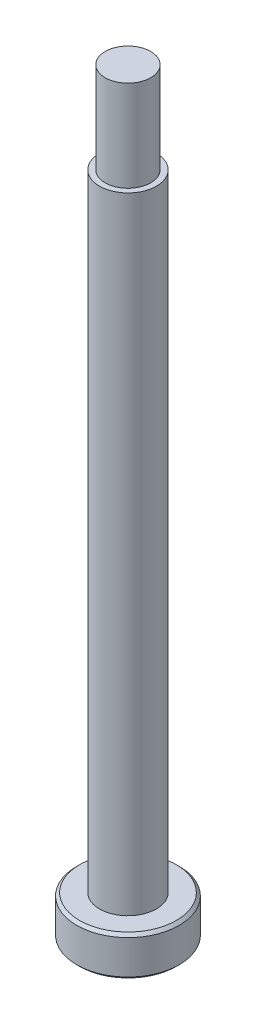
ISO-10303-21;
HEADER;
FILE_DESCRIPTION(('STEP AP214'),'2;1');
FILE_NAME('part.step','',(''),(''),'','','');
FILE_SCHEMA(('AUTOMOTIVE_DESIGN { 1 0 10303 214 1 1 1 1 }'));
ENDSEC;
DATA;
#1=APPLICATION_CONTEXT('core data for automotive mechanical design processes');
#2=APPLICATION_PROTOCOL_DEFINITION('international standard','automotive_design',2000,#1);
#3=PRODUCT_CONTEXT('',#1,'mechanical');
#4=PRODUCT('Part','Part','',(#3));
#5=PRODUCT_RELATED_PRODUCT_CATEGORY('part','',(#4));
#6=PRODUCT_DEFINITION_FORMATION('','',#4);
#7=PRODUCT_DEFINITION_CONTEXT('part definition',#1,'design');
#8=PRODUCT_DEFINITION('design','',#6,#7);
#9=PRODUCT_DEFINITION_SHAPE('','',#8);
#10=(LENGTH_UNIT() NAMED_UNIT(*) SI_UNIT(.MILLI.,.METRE.));
#11=(NAMED_UNIT(*) PLANE_ANGLE_UNIT() SI_UNIT($,.RADIAN.));
#12=(NAMED_UNIT(*) SI_UNIT($,.STERADIAN.) SOLID_ANGLE_UNIT());
#13=UNCERTAINTY_MEASURE_WITH_UNIT(LENGTH_MEASURE(1.E-05),#10,'distance_accuracy_value','');
#14=(GEOMETRIC_REPRESENTATION_CONTEXT(3) GLOBAL_UNCERTAINTY_ASSIGNED_CONTEXT((#13)) GLOBAL_UNIT_ASSIGNED_CONTEXT((#10,
#11,#12)) REPRESENTATION_CONTEXT('',''));
#15=CARTESIAN_POINT('',(0.,0.,0.));
#16=DIRECTION('',(0.,0.,1.));
#17=DIRECTION('',(1.,0.,0.));
#18=AXIS2_PLACEMENT_3D('',#15,#16,#17);
#19=CARTESIAN_POINT('',(0.,-3.5,0.));
#20=DIRECTION('',(0.,1.,0.));
#21=DIRECTION('',(0.,0.,1.));
#22=AXIS2_PLACEMENT_3D('',#19,#20,#21);
#23=CYLINDRICAL_SURFACE('',#22,4.5);
#24=CARTESIAN_POINT('',(0.,-0.250000000000005,0.));
#25=DIRECTION('',(0.,1.,0.));
#26=DIRECTION('',(0.,0.,1.));
#27=AXIS2_PLACEMENT_3D('',#24,#25,#26);
#28=CIRCLE('',#27,4.5);
#29=CARTESIAN_POINT('',(0.,-0.250000000000005,4.5));
#30=VERTEX_POINT('',#29);
#31=EDGE_CURVE('E57',#30,#30,#28,.F.);
#32=ORIENTED_EDGE('',*,*,#31,.T.);
#33=EDGE_LOOP('',(#32));
#34=FACE_BOUND('',#33,.T.);
#35=CARTESIAN_POINT('',(0.,-3.24999999999998,0.));
#36=DIRECTION('',(0.,1.,0.));
#37=DIRECTION('',(0.,0.,1.));
#38=AXIS2_PLACEMENT_3D('',#35,#36,#37);
#39=CIRCLE('',#38,4.5);
#40=CARTESIAN_POINT('',(0.,-3.24999999999998,4.5));
#41=VERTEX_POINT('',#40);
#42=EDGE_CURVE('E192',#41,#41,#39,.T.);
#43=ORIENTED_EDGE('',*,*,#42,.T.);
#44=EDGE_LOOP('',(#43));
#45=FACE_BOUND('',#44,.T.);
#46=ADVANCED_FACE('F47',(#34,#45),#23,.T.);
#47=CARTESIAN_POINT('',(0.,-3.5,0.));
#48=DIRECTION('',(0.,1.,0.));
#49=DIRECTION('',(0.,0.,1.));
#50=AXIS2_PLACEMENT_3D('',#47,#48,#49);
#51=PLANE('',#50);
#52=CARTESIAN_POINT('',(0.,-3.5,0.));
#53=DIRECTION('',(0.,1.,0.));
#54=DIRECTION('',(0.,0.,1.));
#55=AXIS2_PLACEMENT_3D('',#52,#53,#54);
#56=CIRCLE('',#55,4.24999999999998);
#57=CARTESIAN_POINT('',(0.,-3.5,4.24999999999998));
#58=VERTEX_POINT('',#57);
#59=EDGE_CURVE('E11',#58,#58,#56,.F.);
#60=ORIENTED_EDGE('',*,*,#59,.T.);
#61=EDGE_LOOP('',(#60));
#62=FACE_BOUND('',#61,.T.);
#63=DIRECTION('',(0.,0.,1.));
#64=VECTOR('',#63,1.);
#65=CARTESIAN_POINT('',(1.5,-3.5,-0.86602540378444));
#66=LINE('',#65,#64);
#67=CARTESIAN_POINT('',(1.5,-3.5,-0.86602540378444));
#68=VERTEX_POINT('',#67);
#69=CARTESIAN_POINT('',(1.5,-3.5,0.866025403784439));
#70=VERTEX_POINT('',#69);
#71=EDGE_CURVE('E144',#68,#70,#66,.T.);
#72=ORIENTED_EDGE('',*,*,#71,.F.);
#73=DIRECTION('',(0.866025403784439,0.,0.5));
#74=VECTOR('',#73,1.);
#75=CARTESIAN_POINT('',(0.,-3.5,-1.73205080756888));
#76=LINE('',#75,#74);
#77=CARTESIAN_POINT('',(0.,-3.5,-1.73205080756888));
#78=VERTEX_POINT('',#77);
#79=EDGE_CURVE('E64',#78,#68,#76,.T.);
#80=ORIENTED_EDGE('',*,*,#79,.F.);
#81=DIRECTION('',(0.866025403784439,0.,-0.5));
#82=VECTOR('',#81,1.);
#83=CARTESIAN_POINT('',(-1.5,-3.5,-0.866025403784439));
#84=LINE('',#83,#82);
#85=CARTESIAN_POINT('',(-1.5,-3.5,-0.866025403784439));
#86=VERTEX_POINT('',#85);
#87=EDGE_CURVE('E157',#86,#78,#84,.T.);
#88=ORIENTED_EDGE('',*,*,#87,.F.);
#89=DIRECTION('',(0.,0.,-1.));
#90=VECTOR('',#89,1.);
#91=CARTESIAN_POINT('',(-1.5,-3.5,0.866025403784439));
#92=LINE('',#91,#90);
#93=CARTESIAN_POINT('',(-1.5,-3.5,0.866025403784439));
#94=VERTEX_POINT('',#93);
#95=EDGE_CURVE('E154',#94,#86,#92,.T.);
#96=ORIENTED_EDGE('',*,*,#95,.F.);
#97=DIRECTION('',(-0.866025403784439,0.,-0.5));
#98=VECTOR('',#97,1.);
#99=CARTESIAN_POINT('',(0.,-3.5,1.73205080756888));
#100=LINE('',#99,#98);
#101=CARTESIAN_POINT('',(0.,-3.5,1.73205080756888));
#102=VERTEX_POINT('',#101);
#103=EDGE_CURVE('E112',#102,#94,#100,.T.);
#104=ORIENTED_EDGE('',*,*,#103,.F.);
#105=DIRECTION('',(-0.866025403784439,0.,0.5));
#106=VECTOR('',#105,1.);
#107=CARTESIAN_POINT('',(1.5,-3.5,0.866025403784439));
#108=LINE('',#107,#106);
#109=EDGE_CURVE('E148',#70,#102,#108,.T.);
#110=ORIENTED_EDGE('',*,*,#109,.F.);
#111=EDGE_LOOP('',(#72,#80,#88,#96,#104,#110));
#112=FACE_BOUND('',#111,.T.);
#113=ADVANCED_FACE('F210',(#62,#112),#51,.F.);
#114=CARTESIAN_POINT('',(0.,0.,0.));
#115=DIRECTION('',(0.,1.,0.));
#116=DIRECTION('',(0.,0.,1.));
#117=AXIS2_PLACEMENT_3D('',#114,#115,#116);
#118=PLANE('',#117);
#119=CARTESIAN_POINT('',(0.,0.,0.));
#120=DIRECTION('',(0.,1.,0.));
#121=DIRECTION('',(0.,0.,1.));
#122=AXIS2_PLACEMENT_3D('',#119,#120,#121);
#123=CIRCLE('',#122,4.25);
#124=CARTESIAN_POINT('',(0.,0.,4.25));
#125=VERTEX_POINT('',#124);
#126=EDGE_CURVE('E181',#125,#125,#123,.T.);
#127=ORIENTED_EDGE('',*,*,#126,.T.);
#128=EDGE_LOOP('',(#127));
#129=FACE_BOUND('',#128,.T.);
#130=CARTESIAN_POINT('',(0.,0.,0.));
#131=DIRECTION('',(0.,1.,0.));
#132=DIRECTION('',(0.,0.,1.));
#133=AXIS2_PLACEMENT_3D('',#130,#131,#132);
#134=CIRCLE('',#133,2.5);
#135=CARTESIAN_POINT('',(0.,0.,2.5));
#136=VERTEX_POINT('',#135);
#137=EDGE_CURVE('E182',#136,#136,#134,.T.);
#138=ORIENTED_EDGE('',*,*,#137,.F.);
#139=EDGE_LOOP('',(#138));
#140=FACE_BOUND('',#139,.T.);
#141=ADVANCED_FACE('F206',(#129,#140),#118,.T.);
#142=CARTESIAN_POINT('',(0.,55.,0.));
#143=DIRECTION('',(0.,-1.,0.));
#144=DIRECTION('',(0.,0.,-1.));
#145=AXIS2_PLACEMENT_3D('',#142,#143,#144);
#146=CYLINDRICAL_SURFACE('',#145,2.5);
#147=CARTESIAN_POINT('',(0.,55.,0.));
#148=DIRECTION('',(0.,1.,0.));
#149=DIRECTION('',(0.,0.,1.));
#150=AXIS2_PLACEMENT_3D('',#147,#148,#149);
#151=CIRCLE('',#150,2.5);
#152=CARTESIAN_POINT('',(0.,55.,2.5));
#153=VERTEX_POINT('',#152);
#154=EDGE_CURVE('E176',#153,#153,#151,.T.);
#155=ORIENTED_EDGE('',*,*,#154,.F.);
#156=EDGE_LOOP('',(#155));
#157=FACE_BOUND('',#156,.T.);
#158=ORIENTED_EDGE('',*,*,#137,.T.);
#159=EDGE_LOOP('',(#158));
#160=FACE_BOUND('',#159,.T.);
#161=ADVANCED_FACE('F209',(#157,#160),#146,.T.);
#162=CARTESIAN_POINT('',(0.,55.,0.));
#163=DIRECTION('',(0.,1.,0.));
#164=DIRECTION('',(0.,0.,1.));
#165=AXIS2_PLACEMENT_3D('',#162,#163,#164);
#166=PLANE('',#165);
#167=CARTESIAN_POINT('',(0.,55.,0.));
#168=DIRECTION('',(0.,1.,0.));
#169=DIRECTION('',(0.,0.,1.));
#170=AXIS2_PLACEMENT_3D('',#167,#168,#169);
#171=CIRCLE('',#170,2.);
#172=CARTESIAN_POINT('',(0.,55.,2.));
#173=VERTEX_POINT('',#172);
#174=EDGE_CURVE('E177',#173,#173,#171,.T.);
#175=ORIENTED_EDGE('',*,*,#174,.F.);
#176=EDGE_LOOP('',(#175));
#177=FACE_BOUND('',#176,.T.);
#178=ORIENTED_EDGE('',*,*,#154,.T.);
#179=EDGE_LOOP('',(#178));
#180=FACE_BOUND('',#179,.T.);
#181=ADVANCED_FACE('F215',(#177,#180),#166,.T.);
#182=CARTESIAN_POINT('',(0.,63.,0.));
#183=DIRECTION('',(0.,-1.,0.));
#184=DIRECTION('',(0.,0.,-1.));
#185=AXIS2_PLACEMENT_3D('',#182,#183,#184);
#186=CYLINDRICAL_SURFACE('',#185,2.);
#187=CARTESIAN_POINT('',(0.,63.,0.));
#188=DIRECTION('',(0.,1.,0.));
#189=DIRECTION('',(0.,0.,1.));
#190=AXIS2_PLACEMENT_3D('',#187,#188,#189);
#191=CIRCLE('',#190,2.);
#192=CARTESIAN_POINT('',(0.,63.,2.));
#193=VERTEX_POINT('',#192);
#194=EDGE_CURVE('E163',#193,#193,#191,.T.);
#195=ORIENTED_EDGE('',*,*,#194,.F.);
#196=EDGE_LOOP('',(#195));
#197=FACE_BOUND('',#196,.T.);
#198=ORIENTED_EDGE('',*,*,#174,.T.);
#199=EDGE_LOOP('',(#198));
#200=FACE_BOUND('',#199,.T.);
#201=ADVANCED_FACE('F221',(#197,#200),#186,.T.);
#202=CARTESIAN_POINT('',(0.,63.,0.));
#203=DIRECTION('',(0.,1.,0.));
#204=DIRECTION('',(0.,0.,1.));
#205=AXIS2_PLACEMENT_3D('',#202,#203,#204);
#206=PLANE('',#205);
#207=ORIENTED_EDGE('',*,*,#194,.T.);
#208=EDGE_LOOP('',(#207));
#209=FACE_BOUND('',#208,.T.);
#210=ADVANCED_FACE('F253',(#209),#206,.T.);
#211=CARTESIAN_POINT('',(0.,-1.,-1.73205080756888));
#212=DIRECTION('',(0.5,0.,-0.866025403784439));
#213=DIRECTION('',(-0.866025403784439,0.,-0.5));
#214=AXIS2_PLACEMENT_3D('',#211,#212,#213);
#215=PLANE('',#214);
#216=ORIENTED_EDGE('',*,*,#79,.T.);
#217=DIRECTION('',(0.,-1.,0.));
#218=VECTOR('',#217,1.);
#219=CARTESIAN_POINT('',(1.5,-1.,-0.86602540378444));
#220=LINE('',#219,#218);
#221=CARTESIAN_POINT('',(1.5,-1.,-0.86602540378444));
#222=VERTEX_POINT('',#221);
#223=EDGE_CURVE('E94',#222,#68,#220,.T.);
#224=ORIENTED_EDGE('',*,*,#223,.F.);
#225=DIRECTION('',(0.866025403784439,0.,0.5));
#226=VECTOR('',#225,1.);
#227=CARTESIAN_POINT('',(0.,-1.,-1.73205080756888));
#228=LINE('',#227,#226);
#229=CARTESIAN_POINT('',(0.,-1.,-1.73205080756888));
#230=VERTEX_POINT('',#229);
#231=EDGE_CURVE('E160',#230,#222,#228,.T.);
#232=ORIENTED_EDGE('',*,*,#231,.F.);
#233=DIRECTION('',(0.,-1.,0.));
#234=VECTOR('',#233,1.);
#235=CARTESIAN_POINT('',(0.,-1.,-1.73205080756888));
#236=LINE('',#235,#234);
#237=EDGE_CURVE('E72',#230,#78,#236,.T.);
#238=ORIENTED_EDGE('',*,*,#237,.T.);
#239=EDGE_LOOP('',(#216,#224,#232,#238));
#240=FACE_BOUND('',#239,.T.);
#241=ADVANCED_FACE('F250',(#240),#215,.F.);
#242=CARTESIAN_POINT('',(-1.5,-1.,-0.866025403784439));
#243=DIRECTION('',(-0.5,0.,-0.866025403784439));
#244=DIRECTION('',(-0.866025403784439,0.,0.5));
#245=AXIS2_PLACEMENT_3D('',#242,#243,#244);
#246=PLANE('',#245);
#247=ORIENTED_EDGE('',*,*,#87,.T.);
#248=ORIENTED_EDGE('',*,*,#237,.F.);
#249=DIRECTION('',(0.866025403784439,0.,-0.5));
#250=VECTOR('',#249,1.);
#251=CARTESIAN_POINT('',(-1.5,-1.,-0.866025403784439));
#252=LINE('',#251,#250);
#253=CARTESIAN_POINT('',(-1.5,-1.,-0.866025403784439));
#254=VERTEX_POINT('',#253);
#255=EDGE_CURVE('E126',#254,#230,#252,.T.);
#256=ORIENTED_EDGE('',*,*,#255,.F.);
#257=DIRECTION('',(0.,-1.,0.));
#258=VECTOR('',#257,1.);
#259=CARTESIAN_POINT('',(-1.5,-1.,-0.866025403784439));
#260=LINE('',#259,#258);
#261=EDGE_CURVE('E117',#254,#86,#260,.T.);
#262=ORIENTED_EDGE('',*,*,#261,.T.);
#263=EDGE_LOOP('',(#247,#248,#256,#262));
#264=FACE_BOUND('',#263,.T.);
#265=ADVANCED_FACE('F252',(#264),#246,.F.);
#266=CARTESIAN_POINT('',(-1.5,-1.,0.866025403784439));
#267=DIRECTION('',(-1.,0.,0.));
#268=DIRECTION('',(0.,0.,1.));
#269=AXIS2_PLACEMENT_3D('',#266,#267,#268);
#270=PLANE('',#269);
#271=ORIENTED_EDGE('',*,*,#95,.T.);
#272=ORIENTED_EDGE('',*,*,#261,.F.);
#273=DIRECTION('',(0.,0.,-1.));
#274=VECTOR('',#273,1.);
#275=CARTESIAN_POINT('',(-1.5,-1.,0.866025403784439));
#276=LINE('',#275,#274);
#277=CARTESIAN_POINT('',(-1.5,-1.,0.866025403784439));
#278=VERTEX_POINT('',#277);
#279=EDGE_CURVE('E121',#278,#254,#276,.T.);
#280=ORIENTED_EDGE('',*,*,#279,.F.);
#281=DIRECTION('',(0.,-1.,0.));
#282=VECTOR('',#281,1.);
#283=CARTESIAN_POINT('',(-1.5,-1.,0.866025403784439));
#284=LINE('',#283,#282);
#285=EDGE_CURVE('E105',#278,#94,#284,.T.);
#286=ORIENTED_EDGE('',*,*,#285,.T.);
#287=EDGE_LOOP('',(#271,#272,#280,#286));
#288=FACE_BOUND('',#287,.T.);
#289=ADVANCED_FACE('F122',(#288),#270,.F.);
#290=CARTESIAN_POINT('',(0.,-1.,1.73205080756888));
#291=DIRECTION('',(-0.5,0.,0.866025403784439));
#292=DIRECTION('',(0.866025403784439,0.,0.5));
#293=AXIS2_PLACEMENT_3D('',#290,#291,#292);
#294=PLANE('',#293);
#295=ORIENTED_EDGE('',*,*,#103,.T.);
#296=ORIENTED_EDGE('',*,*,#285,.F.);
#297=DIRECTION('',(-0.866025403784439,0.,-0.5));
#298=VECTOR('',#297,1.);
#299=CARTESIAN_POINT('',(0.,-1.,1.73205080756888));
#300=LINE('',#299,#298);
#301=CARTESIAN_POINT('',(0.,-1.,1.73205080756888));
#302=VERTEX_POINT('',#301);
#303=EDGE_CURVE('E109',#302,#278,#300,.T.);
#304=ORIENTED_EDGE('',*,*,#303,.F.);
#305=DIRECTION('',(0.,-1.,0.));
#306=VECTOR('',#305,1.);
#307=CARTESIAN_POINT('',(0.,-1.,1.73205080756888));
#308=LINE('',#307,#306);
#309=EDGE_CURVE('E118',#302,#102,#308,.T.);
#310=ORIENTED_EDGE('',*,*,#309,.T.);
#311=EDGE_LOOP('',(#295,#296,#304,#310));
#312=FACE_BOUND('',#311,.T.);
#313=ADVANCED_FACE('F107',(#312),#294,.F.);
#314=CARTESIAN_POINT('',(1.5,-1.,0.866025403784439));
#315=DIRECTION('',(0.5,0.,0.866025403784439));
#316=DIRECTION('',(0.866025403784439,0.,-0.5));
#317=AXIS2_PLACEMENT_3D('',#314,#315,#316);
#318=PLANE('',#317);
#319=ORIENTED_EDGE('',*,*,#109,.T.);
#320=ORIENTED_EDGE('',*,*,#309,.F.);
#321=DIRECTION('',(-0.866025403784439,0.,0.5));
#322=VECTOR('',#321,1.);
#323=CARTESIAN_POINT('',(1.5,-1.,0.866025403784439));
#324=LINE('',#323,#322);
#325=CARTESIAN_POINT('',(1.5,-1.,0.866025403784439));
#326=VERTEX_POINT('',#325);
#327=EDGE_CURVE('E132',#326,#302,#324,.T.);
#328=ORIENTED_EDGE('',*,*,#327,.F.);
#329=DIRECTION('',(0.,-1.,0.));
#330=VECTOR('',#329,1.);
#331=CARTESIAN_POINT('',(1.5,-1.,0.866025403784439));
#332=LINE('',#331,#330);
#333=EDGE_CURVE('E168',#326,#70,#332,.T.);
#334=ORIENTED_EDGE('',*,*,#333,.T.);
#335=EDGE_LOOP('',(#319,#320,#328,#334));
#336=FACE_BOUND('',#335,.T.);
#337=ADVANCED_FACE('F308',(#336),#318,.F.);
#338=CARTESIAN_POINT('',(1.5,-1.,-0.86602540378444));
#339=DIRECTION('',(1.,0.,0.));
#340=DIRECTION('',(0.,0.,-1.));
#341=AXIS2_PLACEMENT_3D('',#338,#339,#340);
#342=PLANE('',#341);
#343=ORIENTED_EDGE('',*,*,#71,.T.);
#344=ORIENTED_EDGE('',*,*,#333,.F.);
#345=DIRECTION('',(0.,0.,1.));
#346=VECTOR('',#345,1.);
#347=CARTESIAN_POINT('',(1.5,-1.,-0.86602540378444));
#348=LINE('',#347,#346);
#349=EDGE_CURVE('E136',#222,#326,#348,.T.);
#350=ORIENTED_EDGE('',*,*,#349,.F.);
#351=ORIENTED_EDGE('',*,*,#223,.T.);
#352=EDGE_LOOP('',(#343,#344,#350,#351));
#353=FACE_BOUND('',#352,.T.);
#354=ADVANCED_FACE('F246',(#353),#342,.F.);
#355=CARTESIAN_POINT('',(0.,-1.,0.));
#356=DIRECTION('',(0.,-1.,0.));
#357=DIRECTION('',(0.,0.,-1.));
#358=AXIS2_PLACEMENT_3D('',#355,#356,#357);
#359=PLANE('',#358);
#360=ORIENTED_EDGE('',*,*,#231,.T.);
#361=ORIENTED_EDGE('',*,*,#349,.T.);
#362=ORIENTED_EDGE('',*,*,#327,.T.);
#363=ORIENTED_EDGE('',*,*,#303,.T.);
#364=ORIENTED_EDGE('',*,*,#279,.T.);
#365=ORIENTED_EDGE('',*,*,#255,.T.);
#366=EDGE_LOOP('',(#360,#361,#362,#363,#364,#365));
#367=FACE_BOUND('',#366,.T.);
#368=ADVANCED_FACE('F129',(#367),#359,.T.);
#369=CARTESIAN_POINT('',(0.,0.,0.));
#370=DIRECTION('',(0.,-1.,0.));
#371=DIRECTION('',(0.,0.,-1.));
#372=AXIS2_PLACEMENT_3D('',#369,#370,#371);
#373=CONICAL_SURFACE('',#372,4.25,0.785398163397445);
#374=ORIENTED_EDGE('',*,*,#31,.F.);
#375=EDGE_LOOP('',(#374));
#376=FACE_BOUND('',#375,.T.);
#377=ORIENTED_EDGE('',*,*,#126,.F.);
#378=EDGE_LOOP('',(#377));
#379=FACE_BOUND('',#378,.T.);
#380=ADVANCED_FACE('F201',(#376,#379),#373,.T.);
#381=CARTESIAN_POINT('',(0.,-3.24999999999998,0.));
#382=DIRECTION('',(0.,1.,0.));
#383=DIRECTION('',(0.,0.,1.));
#384=AXIS2_PLACEMENT_3D('',#381,#382,#383);
#385=CONICAL_SURFACE('',#384,4.5,0.785398163397452);
#386=ORIENTED_EDGE('',*,*,#59,.F.);
#387=EDGE_LOOP('',(#386));
#388=FACE_BOUND('',#387,.T.);
#389=ORIENTED_EDGE('',*,*,#42,.F.);
#390=EDGE_LOOP('',(#389));
#391=FACE_BOUND('',#390,.T.);
#392=ADVANCED_FACE('F50',(#388,#391),#385,.T.);
#393=CLOSED_SHELL('',(#46,#113,#141,#161,#181,#201,#210,#241,#265,#289,#313,#337,#354,#368,#380,#392));
#394=MANIFOLD_SOLID_BREP('B2',#393);
#395=ADVANCED_BREP_SHAPE_REPRESENTATION('',(#18,#394),#14);
#396=SHAPE_DEFINITION_REPRESENTATION(#9,#395);
ENDSEC;
END-ISO-10303-21;
